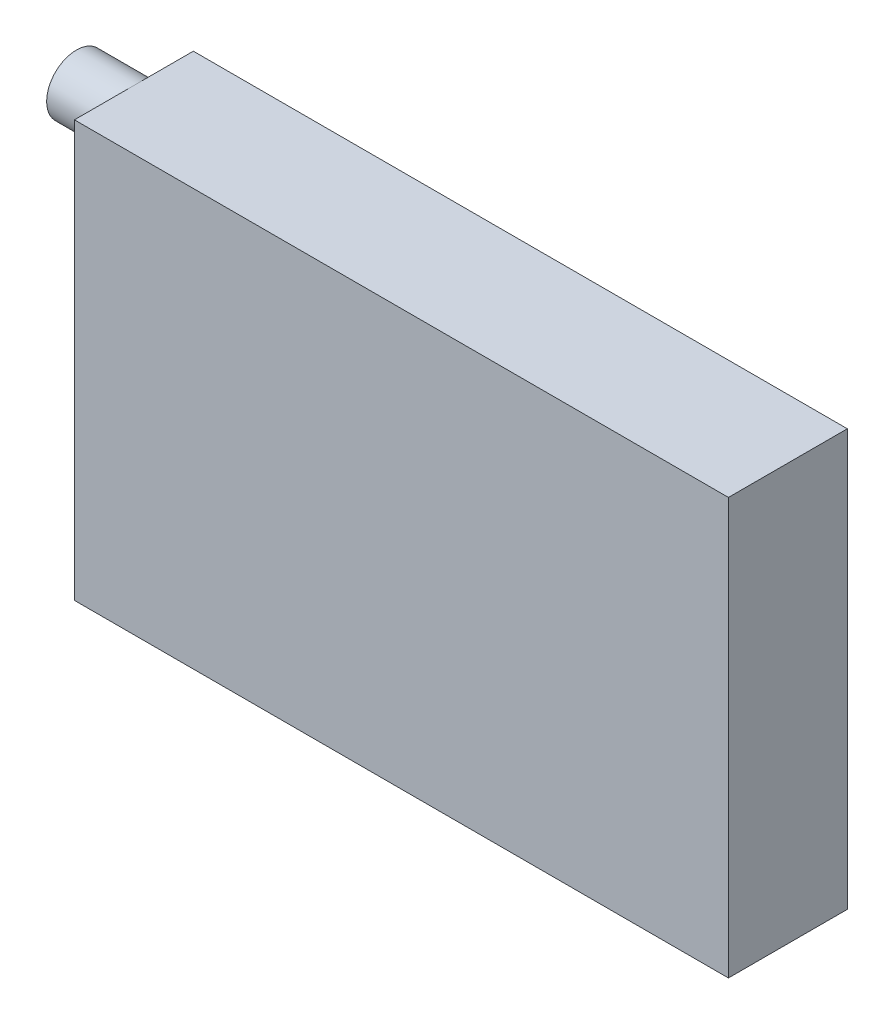
ISO-10303-21;
HEADER;
FILE_DESCRIPTION(('STEP AP214'),'2;1');
FILE_NAME('part.step','',(''),(''),'','','');
FILE_SCHEMA(('AUTOMOTIVE_DESIGN { 1 0 10303 214 1 1 1 1 }'));
ENDSEC;
DATA;
#1=APPLICATION_CONTEXT('core data for automotive mechanical design processes');
#2=APPLICATION_PROTOCOL_DEFINITION('international standard','automotive_design',2000,#1);
#3=PRODUCT_CONTEXT('',#1,'mechanical');
#4=PRODUCT('Part','Part','',(#3));
#5=PRODUCT_RELATED_PRODUCT_CATEGORY('part','',(#4));
#6=PRODUCT_DEFINITION_FORMATION('','',#4);
#7=PRODUCT_DEFINITION_CONTEXT('part definition',#1,'design');
#8=PRODUCT_DEFINITION('design','',#6,#7);
#9=PRODUCT_DEFINITION_SHAPE('','',#8);
#10=(LENGTH_UNIT() NAMED_UNIT(*) SI_UNIT(.MILLI.,.METRE.));
#11=(NAMED_UNIT(*) PLANE_ANGLE_UNIT() SI_UNIT($,.RADIAN.));
#12=(NAMED_UNIT(*) SI_UNIT($,.STERADIAN.) SOLID_ANGLE_UNIT());
#13=UNCERTAINTY_MEASURE_WITH_UNIT(LENGTH_MEASURE(1.E-05),#10,'distance_accuracy_value','');
#14=(GEOMETRIC_REPRESENTATION_CONTEXT(3) GLOBAL_UNCERTAINTY_ASSIGNED_CONTEXT((#13)) GLOBAL_UNIT_ASSIGNED_CONTEXT((#10,
#11,#12)) REPRESENTATION_CONTEXT('',''));
#15=CARTESIAN_POINT('',(0.,0.,0.));
#16=DIRECTION('',(0.,0.,1.));
#17=DIRECTION('',(1.,0.,0.));
#18=AXIS2_PLACEMENT_3D('',#15,#16,#17);
#19=CARTESIAN_POINT('',(55.,35.,20.));
#20=DIRECTION('',(-1.,0.,0.));
#21=DIRECTION('',(0.,-1.,0.));
#22=AXIS2_PLACEMENT_3D('',#19,#20,#21);
#23=PLANE('',#22);
#24=DIRECTION('',(0.,1.,0.));
#25=VECTOR('',#24,1.);
#26=CARTESIAN_POINT('',(55.,35.,0.));
#27=LINE('',#26,#25);
#28=CARTESIAN_POINT('',(55.,-35.,0.));
#29=VERTEX_POINT('',#28);
#30=CARTESIAN_POINT('',(55.,35.,0.));
#31=VERTEX_POINT('',#30);
#32=EDGE_CURVE('E104',#29,#31,#27,.T.);
#33=ORIENTED_EDGE('',*,*,#32,.T.);
#34=DIRECTION('',(0.,0.,-1.));
#35=VECTOR('',#34,1.);
#36=CARTESIAN_POINT('',(55.,35.,20.));
#37=LINE('',#36,#35);
#38=CARTESIAN_POINT('',(55.,35.,20.));
#39=VERTEX_POINT('',#38);
#40=EDGE_CURVE('E11',#39,#31,#37,.T.);
#41=ORIENTED_EDGE('',*,*,#40,.F.);
#42=DIRECTION('',(0.,1.,0.));
#43=VECTOR('',#42,1.);
#44=CARTESIAN_POINT('',(55.,35.,20.));
#45=LINE('',#44,#43);
#46=CARTESIAN_POINT('',(55.,-35.,20.));
#47=VERTEX_POINT('',#46);
#48=EDGE_CURVE('E101',#47,#39,#45,.T.);
#49=ORIENTED_EDGE('',*,*,#48,.F.);
#50=DIRECTION('',(0.,0.,-1.));
#51=VECTOR('',#50,1.);
#52=CARTESIAN_POINT('',(55.,-35.,20.));
#53=LINE('',#52,#51);
#54=EDGE_CURVE('E96',#47,#29,#53,.T.);
#55=ORIENTED_EDGE('',*,*,#54,.T.);
#56=EDGE_LOOP('',(#33,#41,#49,#55));
#57=FACE_BOUND('',#56,.T.);
#58=ADVANCED_FACE('F35',(#57),#23,.F.);
#59=CARTESIAN_POINT('',(-55.,35.,20.));
#60=DIRECTION('',(0.,-1.,0.));
#61=DIRECTION('',(0.,0.,-1.));
#62=AXIS2_PLACEMENT_3D('',#59,#60,#61);
#63=PLANE('',#62);
#64=DIRECTION('',(-1.,0.,0.));
#65=VECTOR('',#64,1.);
#66=CARTESIAN_POINT('',(-55.,35.,0.));
#67=LINE('',#66,#65);
#68=CARTESIAN_POINT('',(-55.,35.,0.));
#69=VERTEX_POINT('',#68);
#70=EDGE_CURVE('E94',#31,#69,#67,.T.);
#71=ORIENTED_EDGE('',*,*,#70,.T.);
#72=DIRECTION('',(0.,0.,-1.));
#73=VECTOR('',#72,1.);
#74=CARTESIAN_POINT('',(-55.,35.,20.));
#75=LINE('',#74,#73);
#76=CARTESIAN_POINT('',(-55.,35.,9.66924466822404));
#77=VERTEX_POINT('',#76);
#78=EDGE_CURVE('E91',#77,#69,#75,.T.);
#79=ORIENTED_EDGE('',*,*,#78,.F.);
#80=CARTESIAN_POINT('',(-55.,35.,20.));
#81=VERTEX_POINT('',#80);
#82=EDGE_CURVE('E43',#81,#77,#75,.T.);
#83=ORIENTED_EDGE('',*,*,#82,.F.);
#84=DIRECTION('',(-1.,0.,0.));
#85=VECTOR('',#84,1.);
#86=CARTESIAN_POINT('',(-55.,35.,20.));
#87=LINE('',#86,#85);
#88=EDGE_CURVE('E81',#39,#81,#87,.T.);
#89=ORIENTED_EDGE('',*,*,#88,.F.);
#90=ORIENTED_EDGE('',*,*,#40,.T.);
#91=EDGE_LOOP('',(#71,#79,#83,#89,#90));
#92=FACE_BOUND('',#91,.T.);
#93=ADVANCED_FACE('F93',(#92),#63,.F.);
#94=CARTESIAN_POINT('',(-55.,35.,20.));
#95=DIRECTION('',(1.,0.,0.));
#96=DIRECTION('',(0.,0.,-1.));
#97=AXIS2_PLACEMENT_3D('',#94,#95,#96);
#98=PLANE('',#97);
#99=ORIENTED_EDGE('',*,*,#82,.T.);
#100=CARTESIAN_POINT('',(-55.,30.,9.66924466822404));
#101=DIRECTION('',(-1.,0.,0.));
#102=DIRECTION('',(0.,0.,1.));
#103=AXIS2_PLACEMENT_3D('',#100,#101,#102);
#104=CIRCLE('',#103,5.);
#105=EDGE_CURVE('E89',#77,#77,#104,.T.);
#106=ORIENTED_EDGE('',*,*,#105,.F.);
#107=ORIENTED_EDGE('',*,*,#78,.T.);
#108=DIRECTION('',(0.,-1.,0.));
#109=VECTOR('',#108,1.);
#110=CARTESIAN_POINT('',(-55.,35.,0.));
#111=LINE('',#110,#109);
#112=CARTESIAN_POINT('',(-55.,-35.,0.));
#113=VERTEX_POINT('',#112);
#114=EDGE_CURVE('E68',#69,#113,#111,.T.);
#115=ORIENTED_EDGE('',*,*,#114,.T.);
#116=DIRECTION('',(0.,0.,-1.));
#117=VECTOR('',#116,1.);
#118=CARTESIAN_POINT('',(-55.,-35.,20.));
#119=LINE('',#118,#117);
#120=CARTESIAN_POINT('',(-55.,-35.,20.));
#121=VERTEX_POINT('',#120);
#122=EDGE_CURVE('E95',#121,#113,#119,.T.);
#123=ORIENTED_EDGE('',*,*,#122,.F.);
#124=DIRECTION('',(0.,-1.,0.));
#125=VECTOR('',#124,1.);
#126=CARTESIAN_POINT('',(-55.,35.,20.));
#127=LINE('',#126,#125);
#128=EDGE_CURVE('E90',#81,#121,#127,.T.);
#129=ORIENTED_EDGE('',*,*,#128,.F.);
#130=EDGE_LOOP('',(#99,#106,#107,#115,#123,#129));
#131=FACE_BOUND('',#130,.T.);
#132=ADVANCED_FACE('F87',(#131),#98,.F.);
#133=CARTESIAN_POINT('',(-55.,-35.,20.));
#134=DIRECTION('',(0.,1.,0.));
#135=DIRECTION('',(0.,0.,1.));
#136=AXIS2_PLACEMENT_3D('',#133,#134,#135);
#137=PLANE('',#136);
#138=DIRECTION('',(1.,0.,0.));
#139=VECTOR('',#138,1.);
#140=CARTESIAN_POINT('',(-55.,-35.,0.));
#141=LINE('',#140,#139);
#142=EDGE_CURVE('E74',#113,#29,#141,.T.);
#143=ORIENTED_EDGE('',*,*,#142,.T.);
#144=ORIENTED_EDGE('',*,*,#54,.F.);
#145=DIRECTION('',(1.,0.,0.));
#146=VECTOR('',#145,1.);
#147=CARTESIAN_POINT('',(-55.,-35.,20.));
#148=LINE('',#147,#146);
#149=EDGE_CURVE('E51',#121,#47,#148,.T.);
#150=ORIENTED_EDGE('',*,*,#149,.F.);
#151=ORIENTED_EDGE('',*,*,#122,.T.);
#152=EDGE_LOOP('',(#143,#144,#150,#151));
#153=FACE_BOUND('',#152,.T.);
#154=ADVANCED_FACE('F140',(#153),#137,.F.);
#155=CARTESIAN_POINT('',(0.,0.,20.));
#156=DIRECTION('',(0.,0.,1.));
#157=DIRECTION('',(1.,0.,0.));
#158=AXIS2_PLACEMENT_3D('',#155,#156,#157);
#159=PLANE('',#158);
#160=ORIENTED_EDGE('',*,*,#48,.T.);
#161=ORIENTED_EDGE('',*,*,#88,.T.);
#162=ORIENTED_EDGE('',*,*,#128,.T.);
#163=ORIENTED_EDGE('',*,*,#149,.T.);
#164=EDGE_LOOP('',(#160,#161,#162,#163));
#165=FACE_BOUND('',#164,.T.);
#166=ADVANCED_FACE('F128',(#165),#159,.T.);
#167=CARTESIAN_POINT('',(0.,0.,0.));
#168=DIRECTION('',(0.,0.,1.));
#169=DIRECTION('',(1.,0.,0.));
#170=AXIS2_PLACEMENT_3D('',#167,#168,#169);
#171=PLANE('',#170);
#172=ORIENTED_EDGE('',*,*,#32,.F.);
#173=ORIENTED_EDGE('',*,*,#142,.F.);
#174=ORIENTED_EDGE('',*,*,#114,.F.);
#175=ORIENTED_EDGE('',*,*,#70,.F.);
#176=EDGE_LOOP('',(#172,#173,#174,#175));
#177=FACE_BOUND('',#176,.T.);
#178=ADVANCED_FACE('F121',(#177),#171,.F.);
#179=CARTESIAN_POINT('',(-65.,30.,9.66924466822404));
#180=DIRECTION('',(1.,0.,0.));
#181=DIRECTION('',(0.,0.,-1.));
#182=AXIS2_PLACEMENT_3D('',#179,#180,#181);
#183=CYLINDRICAL_SURFACE('',#182,5.);
#184=CARTESIAN_POINT('',(-65.,30.,9.66924466822404));
#185=DIRECTION('',(-1.,0.,0.));
#186=DIRECTION('',(0.,0.,1.));
#187=AXIS2_PLACEMENT_3D('',#184,#185,#186);
#188=CIRCLE('',#187,5.);
#189=CARTESIAN_POINT('',(-65.,30.,14.669244668224));
#190=VERTEX_POINT('',#189);
#191=EDGE_CURVE('E107',#190,#190,#188,.T.);
#192=ORIENTED_EDGE('',*,*,#191,.F.);
#193=EDGE_LOOP('',(#192));
#194=FACE_BOUND('',#193,.T.);
#195=ORIENTED_EDGE('',*,*,#105,.T.);
#196=EDGE_LOOP('',(#195));
#197=FACE_BOUND('',#196,.T.);
#198=ADVANCED_FACE('F118',(#194,#197),#183,.T.);
#199=CARTESIAN_POINT('',(-65.,30.,9.66924466822404));
#200=DIRECTION('',(-1.,0.,0.));
#201=DIRECTION('',(0.,0.,1.));
#202=AXIS2_PLACEMENT_3D('',#199,#200,#201);
#203=PLANE('',#202);
#204=ORIENTED_EDGE('',*,*,#191,.T.);
#205=EDGE_LOOP('',(#204));
#206=FACE_BOUND('',#205,.T.);
#207=ADVANCED_FACE('F116',(#206),#203,.T.);
#208=CLOSED_SHELL('',(#58,#93,#132,#154,#166,#178,#198,#207));
#209=MANIFOLD_SOLID_BREP('B2',#208);
#210=ADVANCED_BREP_SHAPE_REPRESENTATION('',(#18,#209),#14);
#211=SHAPE_DEFINITION_REPRESENTATION(#9,#210);
ENDSEC;
END-ISO-10303-21;
